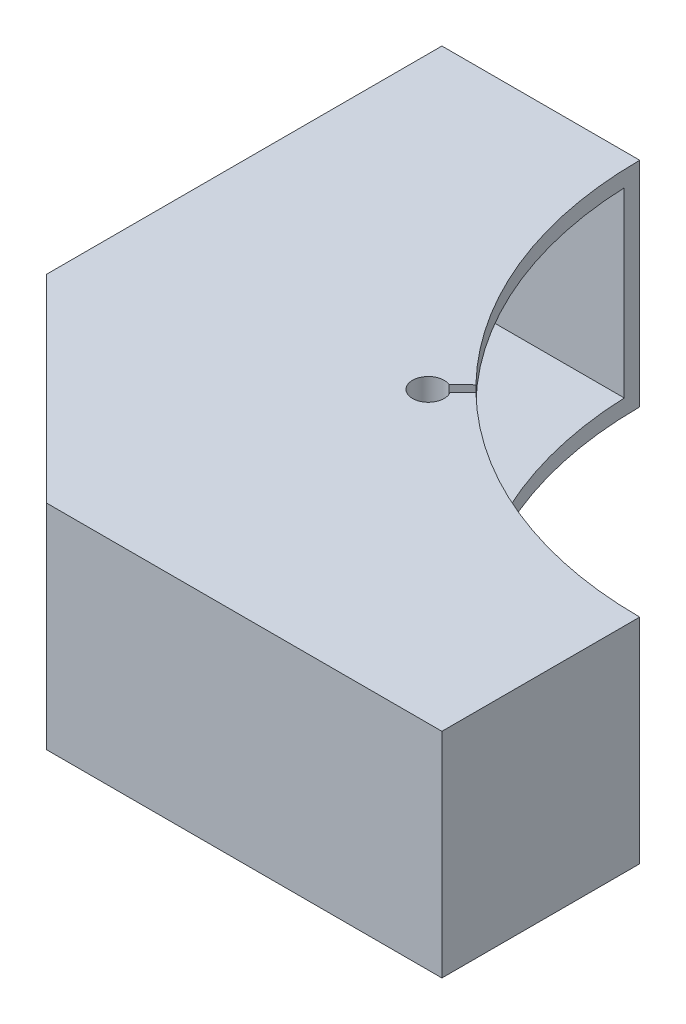
ISO-10303-21;
HEADER;
FILE_DESCRIPTION(('STEP AP214'),'2;1');
FILE_NAME('part.step','',(''),(''),'','','');
FILE_SCHEMA(('AUTOMOTIVE_DESIGN { 1 0 10303 214 1 1 1 1 }'));
ENDSEC;
DATA;
#1=APPLICATION_CONTEXT('core data for automotive mechanical design processes');
#2=APPLICATION_PROTOCOL_DEFINITION('international standard','automotive_design',2000,#1);
#3=PRODUCT_CONTEXT('',#1,'mechanical');
#4=PRODUCT('Part','Part','',(#3));
#5=PRODUCT_RELATED_PRODUCT_CATEGORY('part','',(#4));
#6=PRODUCT_DEFINITION_FORMATION('','',#4);
#7=PRODUCT_DEFINITION_CONTEXT('part definition',#1,'design');
#8=PRODUCT_DEFINITION('design','',#6,#7);
#9=PRODUCT_DEFINITION_SHAPE('','',#8);
#10=(LENGTH_UNIT() NAMED_UNIT(*) SI_UNIT(.MILLI.,.METRE.));
#11=(NAMED_UNIT(*) PLANE_ANGLE_UNIT() SI_UNIT($,.RADIAN.));
#12=(NAMED_UNIT(*) SI_UNIT($,.STERADIAN.) SOLID_ANGLE_UNIT());
#13=UNCERTAINTY_MEASURE_WITH_UNIT(LENGTH_MEASURE(1.E-05),#10,'distance_accuracy_value','');
#14=(GEOMETRIC_REPRESENTATION_CONTEXT(3) GLOBAL_UNCERTAINTY_ASSIGNED_CONTEXT((#13)) GLOBAL_UNIT_ASSIGNED_CONTEXT((#10,
#11,#12)) REPRESENTATION_CONTEXT('',''));
#15=CARTESIAN_POINT('',(0.,0.,0.));
#16=DIRECTION('',(0.,0.,1.));
#17=DIRECTION('',(1.,0.,0.));
#18=AXIS2_PLACEMENT_3D('',#15,#16,#17);
#19=CARTESIAN_POINT('',(0.,25.,-74.9999999580492));
#20=DIRECTION('',(0.,-1.,0.));
#21=DIRECTION('',(0.,0.,-1.));
#22=AXIS2_PLACEMENT_3D('',#19,#20,#21);
#23=PLANE('',#22);
#24=DIRECTION('',(0.715540732755675,0.,-0.698571012687666));
#25=VECTOR('',#24,1.);
#26=CARTESIAN_POINT('',(0.,25.,-74.9999999580491));
#27=LINE('',#26,#25);
#28=CARTESIAN_POINT('',(-35.8003233854942,25.,-40.0487148430338));
#29=VERTEX_POINT('',#28);
#30=CARTESIAN_POINT('',(-35.7770366077663,25.,-40.0714493529715));
#31=VERTEX_POINT('',#30);
#32=EDGE_CURVE('E458',#29,#31,#27,.T.);
#33=ORIENTED_EDGE('',*,*,#32,.F.);
#34=CARTESIAN_POINT('',(-38.2770016922572,25.,-36.5609110701959));
#35=DIRECTION('',(0.,-1.,0.));
#36=DIRECTION('',(0.,0.,-1.));
#37=AXIS2_PLACEMENT_3D('',#34,#35,#36);
#38=CIRCLE('',#37,4.27769921722097);
#39=CARTESIAN_POINT('',(-34.9285079943552,25.,-39.2229216915351));
#40=VERTEX_POINT('',#39);
#41=EDGE_CURVE('E242',#40,#29,#38,.T.);
#42=ORIENTED_EDGE('',*,*,#41,.F.);
#43=CARTESIAN_POINT('',(0.,25.,-74.9999999580492));
#44=DIRECTION('',(0.,-1.,0.));
#45=DIRECTION('',(0.,0.,-1.));
#46=AXIS2_PLACEMENT_3D('',#43,#44,#45);
#47=CIRCLE('',#46,50.);
#48=CARTESIAN_POINT('',(-2.,25.,-25.040015970862));
#49=VERTEX_POINT('',#48);
#50=EDGE_CURVE('E417',#49,#40,#47,.T.);
#51=ORIENTED_EDGE('',*,*,#50,.F.);
#52=DIRECTION('',(0.,0.,-1.));
#53=VECTOR('',#52,1.);
#54=CARTESIAN_POINT('',(-2.,25.,-74.9999999580492));
#55=LINE('',#54,#53);
#56=CARTESIAN_POINT('',(-2.,25.,-2.00000000000001));
#57=VERTEX_POINT('',#56);
#58=EDGE_CURVE('E414',#57,#49,#55,.T.);
#59=ORIENTED_EDGE('',*,*,#58,.F.);
#60=DIRECTION('',(1.,0.,0.));
#61=VECTOR('',#60,1.);
#62=CARTESIAN_POINT('',(-5.99988808345734E-13,25.,-2.));
#63=LINE('',#62,#61);
#64=CARTESIAN_POINT('',(-49.1715728752538,25.,-2.00000000000034));
#65=VERTEX_POINT('',#64);
#66=EDGE_CURVE('E423',#65,#57,#63,.T.);
#67=ORIENTED_EDGE('',*,*,#66,.F.);
#68=DIRECTION('',(0.707106781186553,0.,0.707106781186542));
#69=VECTOR('',#68,1.);
#70=CARTESIAN_POINT('',(-61.085786416651,25.,-13.9142135413973));
#71=LINE('',#70,#69);
#72=CARTESIAN_POINT('',(-57.2752746399999,25.,-10.1037017647463));
#73=VERTEX_POINT('',#72);
#74=EDGE_CURVE('E436',#73,#65,#71,.T.);
#75=ORIENTED_EDGE('',*,*,#74,.F.);
#76=DIRECTION('',(-0.707106781186542,0.,0.707106781186553));
#77=VECTOR('',#76,1.);
#78=CARTESIAN_POINT('',(-51.9542961115712,25.,-15.4246802931752));
#79=LINE('',#78,#77);
#80=CARTESIAN_POINT('',(-51.9542961115712,25.,-15.4246802931752));
#81=VERTEX_POINT('',#80);
#82=EDGE_CURVE('E407',#81,#73,#79,.T.);
#83=ORIENTED_EDGE('',*,*,#82,.F.);
#84=DIRECTION('',(-0.707106781186553,0.,-0.707106781186542));
#85=VECTOR('',#84,1.);
#86=CARTESIAN_POINT('',(-55.7648078882223,25.,-19.2351920698262));
#87=LINE('',#86,#85);
#88=CARTESIAN_POINT('',(-59.5753196648744,25.,-23.0457038464782));
#89=VERTEX_POINT('',#88);
#90=EDGE_CURVE('E548',#81,#89,#87,.T.);
#91=ORIENTED_EDGE('',*,*,#90,.T.);
#92=DIRECTION('',(-0.707106781186542,0.,0.707106781186553));
#93=VECTOR('',#92,1.);
#94=CARTESIAN_POINT('',(-59.5753196648744,25.,-23.0457038464782));
#95=LINE('',#94,#93);
#96=CARTESIAN_POINT('',(-64.8962981933031,25.,-17.7247253180494));
#97=VERTEX_POINT('',#96);
#98=EDGE_CURVE('E547',#97,#89,#95,.F.);
#99=ORIENTED_EDGE('',*,*,#98,.F.);
#100=CARTESIAN_POINT('',(-72.9999999580492,25.,-25.8284270827954));
#101=VERTEX_POINT('',#100);
#102=EDGE_CURVE('E427',#101,#97,#71,.T.);
#103=ORIENTED_EDGE('',*,*,#102,.F.);
#104=DIRECTION('',(0.,0.,1.));
#105=VECTOR('',#104,1.);
#106=CARTESIAN_POINT('',(-72.9999999580492,25.,-74.9999999580492));
#107=LINE('',#106,#105);
#108=CARTESIAN_POINT('',(-72.9999999580492,25.,-72.9999999580492));
#109=VERTEX_POINT('',#108);
#110=EDGE_CURVE('E442',#109,#101,#107,.T.);
#111=ORIENTED_EDGE('',*,*,#110,.F.);
#112=DIRECTION('',(-1.,0.,0.));
#113=VECTOR('',#112,1.);
#114=CARTESIAN_POINT('',(0.,25.,-72.9999999580492));
#115=LINE('',#114,#113);
#116=CARTESIAN_POINT('',(-49.9599839452028,25.,-72.9999999580492));
#117=VERTEX_POINT('',#116);
#118=EDGE_CURVE('E444',#117,#109,#115,.T.);
#119=ORIENTED_EDGE('',*,*,#118,.F.);
#120=CARTESIAN_POINT('',(0.,25.,-74.9999999580492));
#121=DIRECTION('',(0.,-1.,0.));
#122=DIRECTION('',(0.,0.,-1.));
#123=AXIS2_PLACEMENT_3D('',#120,#121,#122);
#124=CIRCLE('',#123,49.9999999580491);
#125=EDGE_CURVE('E450',#31,#117,#124,.T.);
#126=ORIENTED_EDGE('',*,*,#125,.F.);
#127=EDGE_LOOP('',(#33,#42,#51,#59,#67,#75,#83,#91,#99,#103,#111,#119,#126));
#128=FACE_BOUND('',#127,.T.);
#129=ADVANCED_FACE('F35',(#128),#23,.T.);
#130=CARTESIAN_POINT('',(0.,2.,-74.9999999580492));
#131=DIRECTION('',(0.,-1.,0.));
#132=DIRECTION('',(0.,0.,-1.));
#133=AXIS2_PLACEMENT_3D('',#130,#131,#132);
#134=PLANE('',#133);
#135=CARTESIAN_POINT('',(-38.2770016922572,2.,-36.5609110701959));
#136=DIRECTION('',(0.,1.,0.));
#137=DIRECTION('',(0.,0.,1.));
#138=AXIS2_PLACEMENT_3D('',#135,#136,#137);
#139=CIRCLE('',#138,4.30972208599431);
#140=CARTESIAN_POINT('',(-35.7770366077663,2.,-40.0714493529715));
#141=VERTEX_POINT('',#140);
#142=CARTESIAN_POINT('',(-34.7770585127545,2.,-39.0756878393675));
#143=VERTEX_POINT('',#142);
#144=EDGE_CURVE('E249',#141,#143,#139,.T.);
#145=ORIENTED_EDGE('',*,*,#144,.F.);
#146=CARTESIAN_POINT('',(0.,2.,-74.9999999580492));
#147=DIRECTION('',(0.,-1.,0.));
#148=DIRECTION('',(0.,0.,-1.));
#149=AXIS2_PLACEMENT_3D('',#146,#147,#148);
#150=CIRCLE('',#149,49.9999999580491);
#151=CARTESIAN_POINT('',(-49.9599839452028,2.,-72.9999999580492));
#152=VERTEX_POINT('',#151);
#153=EDGE_CURVE('E400',#141,#152,#150,.T.);
#154=ORIENTED_EDGE('',*,*,#153,.T.);
#155=DIRECTION('',(-1.,0.,0.));
#156=VECTOR('',#155,1.);
#157=CARTESIAN_POINT('',(0.,2.,-72.9999999580492));
#158=LINE('',#157,#156);
#159=CARTESIAN_POINT('',(-72.9999999580492,2.,-72.9999999580492));
#160=VERTEX_POINT('',#159);
#161=EDGE_CURVE('E404',#152,#160,#158,.T.);
#162=ORIENTED_EDGE('',*,*,#161,.T.);
#163=DIRECTION('',(0.,0.,1.));
#164=VECTOR('',#163,1.);
#165=CARTESIAN_POINT('',(-72.9999999580492,2.,-74.9999999580492));
#166=LINE('',#165,#164);
#167=CARTESIAN_POINT('',(-72.9999999580492,2.,-25.8284270827954));
#168=VERTEX_POINT('',#167);
#169=EDGE_CURVE('E440',#160,#168,#166,.T.);
#170=ORIENTED_EDGE('',*,*,#169,.T.);
#171=DIRECTION('',(0.707106781186553,0.,0.707106781186542));
#172=VECTOR('',#171,1.);
#173=CARTESIAN_POINT('',(-61.085786416651,2.,-13.9142135413973));
#174=LINE('',#173,#172);
#175=CARTESIAN_POINT('',(-64.8962981933031,2.,-17.7247253180494));
#176=VERTEX_POINT('',#175);
#177=EDGE_CURVE('E425',#168,#176,#174,.T.);
#178=ORIENTED_EDGE('',*,*,#177,.T.);
#179=DIRECTION('',(-0.707106781186542,0.,0.707106781186553));
#180=VECTOR('',#179,1.);
#181=CARTESIAN_POINT('',(-59.5753196648744,2.,-23.0457038464782));
#182=LINE('',#181,#180);
#183=CARTESIAN_POINT('',(-59.5753196648744,2.,-23.0457038464782));
#184=VERTEX_POINT('',#183);
#185=EDGE_CURVE('E45',#176,#184,#182,.F.);
#186=ORIENTED_EDGE('',*,*,#185,.T.);
#187=DIRECTION('',(-0.707106781186553,0.,-0.707106781186542));
#188=VECTOR('',#187,1.);
#189=CARTESIAN_POINT('',(-55.7648078882223,2.,-19.2351920698262));
#190=LINE('',#189,#188);
#191=CARTESIAN_POINT('',(-51.9542961115712,2.,-15.4246802931752));
#192=VERTEX_POINT('',#191);
#193=EDGE_CURVE('E536',#192,#184,#190,.T.);
#194=ORIENTED_EDGE('',*,*,#193,.F.);
#195=DIRECTION('',(-0.707106781186542,0.,0.707106781186553));
#196=VECTOR('',#195,1.);
#197=CARTESIAN_POINT('',(-51.9542961115712,2.,-15.4246802931752));
#198=LINE('',#197,#196);
#199=CARTESIAN_POINT('',(-57.27527464,2.,-10.1037017647463));
#200=VERTEX_POINT('',#199);
#201=EDGE_CURVE('E11',#192,#200,#198,.T.);
#202=ORIENTED_EDGE('',*,*,#201,.T.);
#203=CARTESIAN_POINT('',(-49.1715728752538,2.,-2.00000000000034));
#204=VERTEX_POINT('',#203);
#205=EDGE_CURVE('E433',#200,#204,#174,.T.);
#206=ORIENTED_EDGE('',*,*,#205,.T.);
#207=DIRECTION('',(1.,0.,0.));
#208=VECTOR('',#207,1.);
#209=CARTESIAN_POINT('',(-5.99988808345734E-13,2.,-2.));
#210=LINE('',#209,#208);
#211=CARTESIAN_POINT('',(-2.,2.,-2.00000000000001));
#212=VERTEX_POINT('',#211);
#213=EDGE_CURVE('E418',#204,#212,#210,.T.);
#214=ORIENTED_EDGE('',*,*,#213,.T.);
#215=DIRECTION('',(0.,0.,-1.));
#216=VECTOR('',#215,1.);
#217=CARTESIAN_POINT('',(-2.,2.,-74.9999999580492));
#218=LINE('',#217,#216);
#219=CARTESIAN_POINT('',(-2.,2.,-25.040015970862));
#220=VERTEX_POINT('',#219);
#221=EDGE_CURVE('E406',#212,#220,#218,.T.);
#222=ORIENTED_EDGE('',*,*,#221,.T.);
#223=CARTESIAN_POINT('',(0.,2.,-74.9999999580492));
#224=DIRECTION('',(0.,-1.,0.));
#225=DIRECTION('',(0.,0.,-1.));
#226=AXIS2_PLACEMENT_3D('',#223,#224,#225);
#227=CIRCLE('',#226,50.);
#228=EDGE_CURVE('E394',#220,#143,#227,.T.);
#229=ORIENTED_EDGE('',*,*,#228,.T.);
#230=EDGE_LOOP('',(#145,#154,#162,#170,#178,#186,#194,#202,#206,#214,#222,#229));
#231=FACE_BOUND('',#230,.T.);
#232=ADVANCED_FACE('F343',(#231),#134,.F.);
#233=CARTESIAN_POINT('',(-48.5857864376269,27.,-1.41421356237345));
#234=DIRECTION('',(0.707106781186542,0.,-0.707106781186553));
#235=DIRECTION('',(-0.707106781186553,0.,-0.707106781186542));
#236=AXIS2_PLACEMENT_3D('',#233,#234,#235);
#237=PLANE('',#236);
#238=CARTESIAN_POINT('',(-61.0857864166515,13.5,-13.9142135413979));
#239=DIRECTION('',(0.707106781186542,0.,-0.707106781186553));
#240=DIRECTION('',(-0.707106781186553,0.,-0.707106781186542));
#241=AXIS2_PLACEMENT_3D('',#238,#239,#240);
#242=CIRCLE('',#241,12.7);
#243=EDGE_CURVE('E410',#73,#200,#242,.T.);
#244=ORIENTED_EDGE('',*,*,#243,.F.);
#245=ORIENTED_EDGE('',*,*,#74,.T.);
#246=DIRECTION('',(0.,-1.,0.));
#247=VECTOR('',#246,1.);
#248=CARTESIAN_POINT('',(-49.1715728752538,27.,-2.00000000000034));
#249=LINE('',#248,#247);
#250=EDGE_CURVE('E422',#65,#204,#249,.T.);
#251=ORIENTED_EDGE('',*,*,#250,.T.);
#252=ORIENTED_EDGE('',*,*,#205,.F.);
#253=EDGE_LOOP('',(#244,#245,#251,#252));
#254=FACE_BOUND('',#253,.T.);
#255=ADVANCED_FACE('F337',(#254),#237,.T.);
#256=CARTESIAN_POINT('',(0.,27.,-74.9999999580492));
#257=DIRECTION('',(0.,-1.,0.));
#258=DIRECTION('',(0.,0.,-1.));
#259=AXIS2_PLACEMENT_3D('',#256,#257,#258);
#260=CYLINDRICAL_SURFACE('',#259,50.);
#261=ORIENTED_EDGE('',*,*,#228,.F.);
#262=DIRECTION('',(0.,-1.,0.));
#263=VECTOR('',#262,1.);
#264=CARTESIAN_POINT('',(-2.,25.,-25.040015970862));
#265=LINE('',#264,#263);
#266=EDGE_CURVE('E451',#49,#220,#265,.T.);
#267=ORIENTED_EDGE('',*,*,#266,.F.);
#268=ORIENTED_EDGE('',*,*,#50,.T.);
#269=DIRECTION('',(0.,-1.,0.));
#270=VECTOR('',#269,1.);
#271=CARTESIAN_POINT('',(-34.9285079943551,27.,-39.2229216915351));
#272=LINE('',#271,#270);
#273=CARTESIAN_POINT('',(-34.9285079943551,27.,-39.2229216915351));
#274=VERTEX_POINT('',#273);
#275=EDGE_CURVE('E248',#274,#40,#272,.T.);
#276=ORIENTED_EDGE('',*,*,#275,.F.);
#277=CARTESIAN_POINT('',(0.,27.,-74.9999999580492));
#278=DIRECTION('',(0.,-1.,0.));
#279=DIRECTION('',(0.,0.,-1.));
#280=AXIS2_PLACEMENT_3D('',#277,#278,#279);
#281=CIRCLE('',#280,50.);
#282=CARTESIAN_POINT('',(0.,27.,-24.9999999580492));
#283=VERTEX_POINT('',#282);
#284=EDGE_CURVE('E465',#283,#274,#281,.T.);
#285=ORIENTED_EDGE('',*,*,#284,.F.);
#286=DIRECTION('',(0.,-1.,0.));
#287=VECTOR('',#286,1.);
#288=CARTESIAN_POINT('',(0.,27.,-24.9999999580492));
#289=LINE('',#288,#287);
#290=CARTESIAN_POINT('',(0.,0.,-24.9999999580492));
#291=VERTEX_POINT('',#290);
#292=EDGE_CURVE('E533',#283,#291,#289,.T.);
#293=ORIENTED_EDGE('',*,*,#292,.T.);
#294=CARTESIAN_POINT('',(0.,0.,-74.9999999580492));
#295=DIRECTION('',(0.,-1.,0.));
#296=DIRECTION('',(0.,0.,-1.));
#297=AXIS2_PLACEMENT_3D('',#294,#295,#296);
#298=CIRCLE('',#297,50.);
#299=CARTESIAN_POINT('',(-34.9285079943551,0.,-39.2229216915351));
#300=VERTEX_POINT('',#299);
#301=EDGE_CURVE('E487',#291,#300,#298,.T.);
#302=ORIENTED_EDGE('',*,*,#301,.T.);
#303=CARTESIAN_POINT('',(-34.9285079943551,2.,-39.2229216915351));
#304=VERTEX_POINT('',#303);
#305=EDGE_CURVE('E39',#304,#300,#272,.T.);
#306=ORIENTED_EDGE('',*,*,#305,.F.);
#307=CARTESIAN_POINT('',(-34.7770585127573,2.,-39.0756878393703));
#308=DIRECTION('',(-0.717015503327151,0.,-0.697057220024663));
#309=VECTOR('',#308,1.);
#310=LINE('',#307,#309);
#311=EDGE_CURVE('E53',#143,#304,#310,.T.);
#312=ORIENTED_EDGE('',*,*,#311,.F.);
#313=EDGE_LOOP('',(#261,#267,#268,#276,#285,#293,#302,#306,#312));
#314=FACE_BOUND('',#313,.T.);
#315=ADVANCED_FACE('F387',(#314),#260,.F.);
#316=CARTESIAN_POINT('',(-34.9285079943551,27.,-39.2229216915351));
#317=DIRECTION('',(0.698571012687669,0.,0.715540732755673));
#318=DIRECTION('',(0.715540732755673,0.,-0.698571012687669));
#319=AXIS2_PLACEMENT_3D('',#316,#317,#318);
#320=PLANE('',#319);
#321=DIRECTION('',(0.,-1.,0.));
#322=VECTOR('',#321,1.);
#323=CARTESIAN_POINT('',(-36.5766338547149,27.,-37.6138826828482));
#324=LINE('',#323,#322);
#325=CARTESIAN_POINT('',(-36.5766338547149,6.,-37.6138826828482));
#326=VERTEX_POINT('',#325);
#327=CARTESIAN_POINT('',(-36.5766338547149,0.,-37.6138826828482));
#328=VERTEX_POINT('',#327);
#329=EDGE_CURVE('E529',#326,#328,#324,.T.);
#330=ORIENTED_EDGE('',*,*,#329,.F.);
#331=DIRECTION('',(-0.715540732755674,0.,0.698571012687667));
#332=VECTOR('',#331,1.);
#333=CARTESIAN_POINT('',(-36.5766338547149,6.,-37.6138826828482));
#334=LINE('',#333,#332);
#335=CARTESIAN_POINT('',(-34.9285079943551,6.,-39.2229216915351));
#336=VERTEX_POINT('',#335);
#337=EDGE_CURVE('E261',#336,#326,#334,.T.);
#338=ORIENTED_EDGE('',*,*,#337,.F.);
#339=DIRECTION('',(0.,-1.,0.));
#340=VECTOR('',#339,1.);
#341=CARTESIAN_POINT('',(-34.9285079943551,6.,-39.2229216915351));
#342=LINE('',#341,#340);
#343=EDGE_CURVE('E272',#336,#304,#342,.T.);
#344=ORIENTED_EDGE('',*,*,#343,.T.);
#345=ORIENTED_EDGE('',*,*,#305,.T.);
#346=DIRECTION('',(-0.715540732755673,0.,0.698571012687669));
#347=VECTOR('',#346,1.);
#348=CARTESIAN_POINT('',(-34.9285079943551,0.,-39.2229216915351));
#349=LINE('',#348,#347);
#350=EDGE_CURVE('E490',#300,#328,#349,.T.);
#351=ORIENTED_EDGE('',*,*,#350,.T.);
#352=EDGE_LOOP('',(#330,#338,#344,#345,#351));
#353=FACE_BOUND('',#352,.T.);
#354=ADVANCED_FACE('F386',(#353),#320,.F.);
#355=CARTESIAN_POINT('',(-38.2770016922572,27.,-36.5609110701959));
#356=DIRECTION('',(0.,-1.,0.));
#357=DIRECTION('',(0.,0.,-1.));
#358=AXIS2_PLACEMENT_3D('',#355,#356,#357);
#359=CYLINDRICAL_SURFACE('',#358,1.99999999999999);
#360=DIRECTION('',(0.,-1.,0.));
#361=VECTOR('',#360,1.);
#362=CARTESIAN_POINT('',(-37.4896802359104,27.,-38.3994226759182));
#363=LINE('',#362,#361);
#364=CARTESIAN_POINT('',(-37.4896802359104,6.,-38.3994226759182));
#365=VERTEX_POINT('',#364);
#366=CARTESIAN_POINT('',(-37.4896802359104,0.,-38.3994226759182));
#367=VERTEX_POINT('',#366);
#368=EDGE_CURVE('E526',#365,#367,#363,.T.);
#369=ORIENTED_EDGE('',*,*,#368,.F.);
#370=CARTESIAN_POINT('',(-38.2770016922572,6.,-36.5609110701959));
#371=DIRECTION('',(0.,-1.,0.));
#372=DIRECTION('',(0.,0.,-1.));
#373=AXIS2_PLACEMENT_3D('',#370,#371,#372);
#374=CIRCLE('',#373,1.99999999999999);
#375=EDGE_CURVE('E264',#326,#365,#374,.T.);
#376=ORIENTED_EDGE('',*,*,#375,.F.);
#377=ORIENTED_EDGE('',*,*,#329,.T.);
#378=CARTESIAN_POINT('',(-38.2770016922572,0.,-36.5609110701959));
#379=DIRECTION('',(0.,-1.,0.));
#380=DIRECTION('',(0.,0.,-1.));
#381=AXIS2_PLACEMENT_3D('',#378,#379,#380);
#382=CIRCLE('',#381,1.99999999999999);
#383=EDGE_CURVE('E493',#328,#367,#382,.T.);
#384=ORIENTED_EDGE('',*,*,#383,.T.);
#385=EDGE_LOOP('',(#369,#376,#377,#384));
#386=FACE_BOUND('',#385,.T.);
#387=ADVANCED_FACE('F384',(#386),#359,.F.);
#388=CARTESIAN_POINT('',(-35.7770366077662,27.,-40.0714493529715));
#389=DIRECTION('',(-0.698571012687666,0.,-0.715540732755675));
#390=DIRECTION('',(-0.715540732755675,0.,0.698571012687666));
#391=AXIS2_PLACEMENT_3D('',#388,#389,#390);
#392=PLANE('',#391);
#393=DIRECTION('',(0.,-1.,0.));
#394=VECTOR('',#393,1.);
#395=CARTESIAN_POINT('',(-35.7770366077663,27.,-40.0714493529715));
#396=LINE('',#395,#394);
#397=CARTESIAN_POINT('',(-35.7770366077663,0.,-40.0714493529715));
#398=VERTEX_POINT('',#397);
#399=EDGE_CURVE('E522',#141,#398,#396,.T.);
#400=ORIENTED_EDGE('',*,*,#399,.F.);
#401=DIRECTION('',(0.,-1.,0.));
#402=VECTOR('',#401,1.);
#403=CARTESIAN_POINT('',(-35.7770366077663,6.,-40.0714493529715));
#404=LINE('',#403,#402);
#405=CARTESIAN_POINT('',(-35.7770366077663,6.,-40.0714493529715));
#406=VERTEX_POINT('',#405);
#407=EDGE_CURVE('E269',#406,#141,#404,.T.);
#408=ORIENTED_EDGE('',*,*,#407,.F.);
#409=DIRECTION('',(0.715540732755676,0.,-0.698571012687665));
#410=VECTOR('',#409,1.);
#411=CARTESIAN_POINT('',(-37.4896802359104,6.,-38.3994226759182));
#412=LINE('',#411,#410);
#413=EDGE_CURVE('E267',#365,#406,#412,.T.);
#414=ORIENTED_EDGE('',*,*,#413,.F.);
#415=ORIENTED_EDGE('',*,*,#368,.T.);
#416=DIRECTION('',(0.715540732755675,0.,-0.698571012687666));
#417=VECTOR('',#416,1.);
#418=CARTESIAN_POINT('',(-35.7770366077662,0.,-40.0714493529715));
#419=LINE('',#418,#417);
#420=EDGE_CURVE('E496',#367,#398,#419,.T.);
#421=ORIENTED_EDGE('',*,*,#420,.T.);
#422=EDGE_LOOP('',(#400,#408,#414,#415,#421));
#423=FACE_BOUND('',#422,.T.);
#424=ADVANCED_FACE('F375',(#423),#392,.F.);
#425=CARTESIAN_POINT('',(0.,27.,-74.9999999580492));
#426=DIRECTION('',(0.,-1.,0.));
#427=DIRECTION('',(0.,0.,-1.));
#428=AXIS2_PLACEMENT_3D('',#425,#426,#427);
#429=CYLINDRICAL_SURFACE('',#428,49.9999999580491);
#430=ORIENTED_EDGE('',*,*,#153,.F.);
#431=ORIENTED_EDGE('',*,*,#399,.T.);
#432=CARTESIAN_POINT('',(0.,0.,-74.9999999580492));
#433=DIRECTION('',(0.,-1.,0.));
#434=DIRECTION('',(0.,0.,1.));
#435=AXIS2_PLACEMENT_3D('',#432,#433,#434);
#436=CIRCLE('',#435,49.9999999580491);
#437=CARTESIAN_POINT('',(-49.9999999580492,0.,-74.9999999580492));
#438=VERTEX_POINT('',#437);
#439=EDGE_CURVE('E499',#398,#438,#436,.T.);
#440=ORIENTED_EDGE('',*,*,#439,.T.);
#441=DIRECTION('',(0.,-1.,0.));
#442=VECTOR('',#441,1.);
#443=CARTESIAN_POINT('',(-49.9999999580492,27.,-74.9999999580492));
#444=LINE('',#443,#442);
#445=CARTESIAN_POINT('',(-49.9999999580492,27.,-74.9999999580492));
#446=VERTEX_POINT('',#445);
#447=EDGE_CURVE('E519',#446,#438,#444,.T.);
#448=ORIENTED_EDGE('',*,*,#447,.F.);
#449=CARTESIAN_POINT('',(0.,27.,-74.9999999580492));
#450=DIRECTION('',(0.,-1.,0.));
#451=DIRECTION('',(0.,0.,1.));
#452=AXIS2_PLACEMENT_3D('',#449,#450,#451);
#453=CIRCLE('',#452,49.9999999580491);
#454=CARTESIAN_POINT('',(-35.7770366077663,27.,-40.0714493529715));
#455=VERTEX_POINT('',#454);
#456=EDGE_CURVE('E474',#455,#446,#453,.T.);
#457=ORIENTED_EDGE('',*,*,#456,.F.);
#458=EDGE_CURVE('E523',#455,#31,#396,.T.);
#459=ORIENTED_EDGE('',*,*,#458,.T.);
#460=ORIENTED_EDGE('',*,*,#125,.T.);
#461=DIRECTION('',(0.,-1.,0.));
#462=VECTOR('',#461,1.);
#463=CARTESIAN_POINT('',(-49.9599839452028,25.,-72.9999999580492));
#464=LINE('',#463,#462);
#465=EDGE_CURVE('E447',#117,#152,#464,.T.);
#466=ORIENTED_EDGE('',*,*,#465,.T.);
#467=EDGE_LOOP('',(#430,#431,#440,#448,#457,#459,#460,#466));
#468=FACE_BOUND('',#467,.T.);
#469=ADVANCED_FACE('F372',(#468),#429,.F.);
#470=CARTESIAN_POINT('',(0.,27.,0.));
#471=DIRECTION('',(-1.,0.,0.));
#472=DIRECTION('',(0.,0.,1.));
#473=AXIS2_PLACEMENT_3D('',#470,#471,#472);
#474=PLANE('',#473);
#475=DIRECTION('',(0.,0.,-1.));
#476=VECTOR('',#475,1.);
#477=CARTESIAN_POINT('',(0.,0.,0.));
#478=LINE('',#477,#476);
#479=CARTESIAN_POINT('',(0.,0.,0.));
#480=VERTEX_POINT('',#479);
#481=EDGE_CURVE('E452',#480,#291,#478,.T.);
#482=ORIENTED_EDGE('',*,*,#481,.T.);
#483=ORIENTED_EDGE('',*,*,#292,.F.);
#484=DIRECTION('',(0.,0.,-1.));
#485=VECTOR('',#484,1.);
#486=CARTESIAN_POINT('',(0.,27.,0.));
#487=LINE('',#486,#485);
#488=CARTESIAN_POINT('',(0.,27.,0.));
#489=VERTEX_POINT('',#488);
#490=EDGE_CURVE('E462',#489,#283,#487,.T.);
#491=ORIENTED_EDGE('',*,*,#490,.F.);
#492=DIRECTION('',(0.,-1.,0.));
#493=VECTOR('',#492,1.);
#494=CARTESIAN_POINT('',(0.,27.,0.));
#495=LINE('',#494,#493);
#496=EDGE_CURVE('E484',#489,#480,#495,.T.);
#497=ORIENTED_EDGE('',*,*,#496,.T.);
#498=EDGE_LOOP('',(#482,#483,#491,#497));
#499=FACE_BOUND('',#498,.T.);
#500=ADVANCED_FACE('F37',(#499),#474,.F.);
#501=ORIENTED_EDGE('',*,*,#275,.T.);
#502=DIRECTION('',(0.,1.,0.));
#503=VECTOR('',#502,1.);
#504=CARTESIAN_POINT('',(-34.9285079943552,21.,-39.2229216915351));
#505=LINE('',#504,#503);
#506=CARTESIAN_POINT('',(-34.9285079943552,21.,-39.2229216915351));
#507=VERTEX_POINT('',#506);
#508=EDGE_CURVE('E225',#507,#40,#505,.T.);
#509=ORIENTED_EDGE('',*,*,#508,.F.);
#510=DIRECTION('',(0.715540732755673,0.,-0.698571012687669));
#511=VECTOR('',#510,1.);
#512=CARTESIAN_POINT('',(-36.6509761946929,21.,-37.5413034412389));
#513=LINE('',#512,#511);
#514=CARTESIAN_POINT('',(-36.5766338547149,21.,-37.6138826828482));
#515=VERTEX_POINT('',#514);
#516=EDGE_CURVE('E233',#515,#507,#513,.T.);
#517=ORIENTED_EDGE('',*,*,#516,.F.);
#518=CARTESIAN_POINT('',(-36.5766338547149,27.,-37.6138826828482));
#519=VERTEX_POINT('',#518);
#520=EDGE_CURVE('E530',#519,#515,#324,.T.);
#521=ORIENTED_EDGE('',*,*,#520,.F.);
#522=DIRECTION('',(-0.715540732755673,0.,0.698571012687669));
#523=VECTOR('',#522,1.);
#524=CARTESIAN_POINT('',(-34.9285079943551,27.,-39.2229216915351));
#525=LINE('',#524,#523);
#526=EDGE_CURVE('E468',#274,#519,#525,.T.);
#527=ORIENTED_EDGE('',*,*,#526,.F.);
#528=EDGE_LOOP('',(#501,#509,#517,#521,#527));
#529=FACE_BOUND('',#528,.T.);
#530=ADVANCED_FACE('F245',(#529),#320,.F.);
#531=ORIENTED_EDGE('',*,*,#520,.T.);
#532=CARTESIAN_POINT('',(-38.2770016922572,21.,-36.5609110701959));
#533=DIRECTION('',(0.,-1.,0.));
#534=DIRECTION('',(0.,0.,-1.));
#535=AXIS2_PLACEMENT_3D('',#532,#533,#534);
#536=CIRCLE('',#535,1.99999999999999);
#537=CARTESIAN_POINT('',(-37.4896802359104,21.,-38.3994226759182));
#538=VERTEX_POINT('',#537);
#539=EDGE_CURVE('E239',#538,#515,#536,.F.);
#540=ORIENTED_EDGE('',*,*,#539,.F.);
#541=CARTESIAN_POINT('',(-37.4896802359104,27.,-38.3994226759182));
#542=VERTEX_POINT('',#541);
#543=EDGE_CURVE('E527',#542,#538,#363,.T.);
#544=ORIENTED_EDGE('',*,*,#543,.F.);
#545=CARTESIAN_POINT('',(-38.2770016922572,27.,-36.5609110701959));
#546=DIRECTION('',(0.,-1.,0.));
#547=DIRECTION('',(0.,0.,-1.));
#548=AXIS2_PLACEMENT_3D('',#545,#546,#547);
#549=CIRCLE('',#548,1.99999999999999);
#550=EDGE_CURVE('E470',#519,#542,#549,.T.);
#551=ORIENTED_EDGE('',*,*,#550,.F.);
#552=EDGE_LOOP('',(#531,#540,#544,#551));
#553=FACE_BOUND('',#552,.T.);
#554=ADVANCED_FACE('F379',(#553),#359,.F.);
#555=ORIENTED_EDGE('',*,*,#543,.T.);
#556=DIRECTION('',(-0.715540732755675,0.,0.698571012687666));
#557=VECTOR('',#556,1.);
#558=CARTESIAN_POINT('',(-37.4892010515611,21.,-38.3998904959609));
#559=LINE('',#558,#557);
#560=CARTESIAN_POINT('',(-35.8003233854942,21.,-40.0487148430338));
#561=VERTEX_POINT('',#560);
#562=EDGE_CURVE('E232',#561,#538,#559,.T.);
#563=ORIENTED_EDGE('',*,*,#562,.F.);
#564=DIRECTION('',(0.,1.,0.));
#565=VECTOR('',#564,1.);
#566=CARTESIAN_POINT('',(-35.8003233854942,21.,-40.0487148430338));
#567=LINE('',#566,#565);
#568=EDGE_CURVE('E228',#561,#29,#567,.T.);
#569=ORIENTED_EDGE('',*,*,#568,.T.);
#570=ORIENTED_EDGE('',*,*,#32,.T.);
#571=ORIENTED_EDGE('',*,*,#458,.F.);
#572=DIRECTION('',(0.715540732755675,0.,-0.698571012687666));
#573=VECTOR('',#572,1.);
#574=CARTESIAN_POINT('',(-35.7770366077662,27.,-40.0714493529715));
#575=LINE('',#574,#573);
#576=EDGE_CURVE('E472',#542,#455,#575,.T.);
#577=ORIENTED_EDGE('',*,*,#576,.F.);
#578=EDGE_LOOP('',(#555,#563,#569,#570,#571,#577));
#579=FACE_BOUND('',#578,.T.);
#580=ADVANCED_FACE('F370',(#579),#392,.F.);
#581=CARTESIAN_POINT('',(-74.9999999580492,27.,-74.9999999580492));
#582=DIRECTION('',(0.,0.,1.));
#583=DIRECTION('',(1.,0.,0.));
#584=AXIS2_PLACEMENT_3D('',#581,#582,#583);
#585=PLANE('',#584);
#586=DIRECTION('',(-1.,0.,0.));
#587=VECTOR('',#586,1.);
#588=CARTESIAN_POINT('',(-74.9999999580492,0.,-74.9999999580492));
#589=LINE('',#588,#587);
#590=CARTESIAN_POINT('',(-74.9999999580492,0.,-74.9999999580492));
#591=VERTEX_POINT('',#590);
#592=EDGE_CURVE('E501',#438,#591,#589,.T.);
#593=ORIENTED_EDGE('',*,*,#592,.T.);
#594=DIRECTION('',(0.,-1.,0.));
#595=VECTOR('',#594,1.);
#596=CARTESIAN_POINT('',(-74.9999999580492,27.,-74.9999999580492));
#597=LINE('',#596,#595);
#598=CARTESIAN_POINT('',(-74.9999999580492,27.,-74.9999999580492));
#599=VERTEX_POINT('',#598);
#600=EDGE_CURVE('E516',#599,#591,#597,.T.);
#601=ORIENTED_EDGE('',*,*,#600,.F.);
#602=DIRECTION('',(-1.,0.,0.));
#603=VECTOR('',#602,1.);
#604=CARTESIAN_POINT('',(-74.9999999580492,27.,-74.9999999580492));
#605=LINE('',#604,#603);
#606=EDGE_CURVE('E476',#446,#599,#605,.T.);
#607=ORIENTED_EDGE('',*,*,#606,.F.);
#608=ORIENTED_EDGE('',*,*,#447,.T.);
#609=EDGE_LOOP('',(#593,#601,#607,#608));
#610=FACE_BOUND('',#609,.T.);
#611=ADVANCED_FACE('F366',(#610),#585,.F.);
#612=CARTESIAN_POINT('',(-74.9999999580492,27.,-24.9999999580492));
#613=DIRECTION('',(1.,0.,0.));
#614=DIRECTION('',(0.,0.,-1.));
#615=AXIS2_PLACEMENT_3D('',#612,#613,#614);
#616=PLANE('',#615);
#617=DIRECTION('',(0.,0.,1.));
#618=VECTOR('',#617,1.);
#619=CARTESIAN_POINT('',(-74.9999999580492,0.,-24.9999999580492));
#620=LINE('',#619,#618);
#621=CARTESIAN_POINT('',(-74.9999999580492,0.,-24.9999999580492));
#622=VERTEX_POINT('',#621);
#623=EDGE_CURVE('E503',#591,#622,#620,.T.);
#624=ORIENTED_EDGE('',*,*,#623,.T.);
#625=DIRECTION('',(0.,-1.,0.));
#626=VECTOR('',#625,1.);
#627=CARTESIAN_POINT('',(-74.9999999580492,27.,-24.9999999580492));
#628=LINE('',#627,#626);
#629=CARTESIAN_POINT('',(-74.9999999580492,27.,-24.9999999580492));
#630=VERTEX_POINT('',#629);
#631=EDGE_CURVE('E513',#630,#622,#628,.T.);
#632=ORIENTED_EDGE('',*,*,#631,.F.);
#633=DIRECTION('',(0.,0.,1.));
#634=VECTOR('',#633,1.);
#635=CARTESIAN_POINT('',(-74.9999999580492,27.,-24.9999999580492));
#636=LINE('',#635,#634);
#637=EDGE_CURVE('E478',#599,#630,#636,.T.);
#638=ORIENTED_EDGE('',*,*,#637,.F.);
#639=ORIENTED_EDGE('',*,*,#600,.T.);
#640=EDGE_LOOP('',(#624,#632,#638,#639));
#641=FACE_BOUND('',#640,.T.);
#642=ADVANCED_FACE('F362',(#641),#616,.F.);
#643=CARTESIAN_POINT('',(-50.,27.,-3.46077333457373E-13));
#644=DIRECTION('',(0.707106781186542,0.,-0.707106781186553));
#645=DIRECTION('',(-0.707106781186553,0.,-0.707106781186542));
#646=AXIS2_PLACEMENT_3D('',#643,#644,#645);
#647=PLANE('',#646);
#648=CARTESIAN_POINT('',(-62.4999999790246,13.5,-12.4999999790248));
#649=DIRECTION('',(-0.707106781186542,0.,0.707106781186553));
#650=DIRECTION('',(0.707106781186553,0.,0.707106781186542));
#651=AXIS2_PLACEMENT_3D('',#648,#649,#650);
#652=CIRCLE('',#651,12.7);
#653=CARTESIAN_POINT('',(-53.5197438579554,13.5,-3.51974385795567));
#654=VERTEX_POINT('',#653);
#655=EDGE_CURVE('E276',#654,#654,#652,.T.);
#656=ORIENTED_EDGE('',*,*,#655,.F.);
#657=EDGE_LOOP('',(#656));
#658=FACE_BOUND('',#657,.T.);
#659=DIRECTION('',(0.707106781186553,0.,0.707106781186542));
#660=VECTOR('',#659,1.);
#661=CARTESIAN_POINT('',(-50.,0.,-3.46077333457373E-13));
#662=LINE('',#661,#660);
#663=CARTESIAN_POINT('',(-50.,0.,-3.46077333457373E-13));
#664=VERTEX_POINT('',#663);
#665=EDGE_CURVE('E505',#622,#664,#662,.T.);
#666=ORIENTED_EDGE('',*,*,#665,.T.);
#667=DIRECTION('',(0.,-1.,0.));
#668=VECTOR('',#667,1.);
#669=CARTESIAN_POINT('',(-50.,27.,-3.46077333457373E-13));
#670=LINE('',#669,#668);
#671=CARTESIAN_POINT('',(-50.,27.,-3.46077333457373E-13));
#672=VERTEX_POINT('',#671);
#673=EDGE_CURVE('E510',#672,#664,#670,.T.);
#674=ORIENTED_EDGE('',*,*,#673,.F.);
#675=DIRECTION('',(0.707106781186553,0.,0.707106781186542));
#676=VECTOR('',#675,1.);
#677=CARTESIAN_POINT('',(-50.,27.,-3.46077333457373E-13));
#678=LINE('',#677,#676);
#679=EDGE_CURVE('E480',#630,#672,#678,.T.);
#680=ORIENTED_EDGE('',*,*,#679,.F.);
#681=ORIENTED_EDGE('',*,*,#631,.T.);
#682=EDGE_LOOP('',(#666,#674,#680,#681));
#683=FACE_BOUND('',#682,.T.);
#684=ADVANCED_FACE('F358',(#658,#683),#647,.F.);
#685=CARTESIAN_POINT('',(0.,27.,0.));
#686=DIRECTION('',(0.,0.,-1.));
#687=DIRECTION('',(-1.,0.,0.));
#688=AXIS2_PLACEMENT_3D('',#685,#686,#687);
#689=PLANE('',#688);
#690=DIRECTION('',(1.,0.,0.));
#691=VECTOR('',#690,1.);
#692=CARTESIAN_POINT('',(0.,0.,0.));
#693=LINE('',#692,#691);
#694=EDGE_CURVE('E466',#664,#480,#693,.T.);
#695=ORIENTED_EDGE('',*,*,#694,.T.);
#696=ORIENTED_EDGE('',*,*,#496,.F.);
#697=DIRECTION('',(1.,0.,0.));
#698=VECTOR('',#697,1.);
#699=CARTESIAN_POINT('',(0.,27.,0.));
#700=LINE('',#699,#698);
#701=EDGE_CURVE('E482',#672,#489,#700,.T.);
#702=ORIENTED_EDGE('',*,*,#701,.F.);
#703=ORIENTED_EDGE('',*,*,#673,.T.);
#704=EDGE_LOOP('',(#695,#696,#702,#703));
#705=FACE_BOUND('',#704,.T.);
#706=ADVANCED_FACE('F351',(#705),#689,.F.);
#707=CARTESIAN_POINT('',(0.,27.,-74.9999999580492));
#708=DIRECTION('',(0.,-1.,0.));
#709=DIRECTION('',(0.,0.,-1.));
#710=AXIS2_PLACEMENT_3D('',#707,#708,#709);
#711=PLANE('',#710);
#712=ORIENTED_EDGE('',*,*,#490,.T.);
#713=ORIENTED_EDGE('',*,*,#284,.T.);
#714=ORIENTED_EDGE('',*,*,#526,.T.);
#715=ORIENTED_EDGE('',*,*,#550,.T.);
#716=ORIENTED_EDGE('',*,*,#576,.T.);
#717=ORIENTED_EDGE('',*,*,#456,.T.);
#718=ORIENTED_EDGE('',*,*,#606,.T.);
#719=ORIENTED_EDGE('',*,*,#637,.T.);
#720=ORIENTED_EDGE('',*,*,#679,.T.);
#721=ORIENTED_EDGE('',*,*,#701,.T.);
#722=EDGE_LOOP('',(#712,#713,#714,#715,#716,#717,#718,#719,#720,#721));
#723=FACE_BOUND('',#722,.T.);
#724=ADVANCED_FACE('F348',(#723),#711,.F.);
#725=CARTESIAN_POINT('',(0.,0.,-74.9999999580492));
#726=DIRECTION('',(0.,-1.,0.));
#727=DIRECTION('',(0.,0.,-1.));
#728=AXIS2_PLACEMENT_3D('',#725,#726,#727);
#729=PLANE('',#728);
#730=ORIENTED_EDGE('',*,*,#481,.F.);
#731=ORIENTED_EDGE('',*,*,#694,.F.);
#732=ORIENTED_EDGE('',*,*,#665,.F.);
#733=ORIENTED_EDGE('',*,*,#623,.F.);
#734=ORIENTED_EDGE('',*,*,#592,.F.);
#735=ORIENTED_EDGE('',*,*,#439,.F.);
#736=ORIENTED_EDGE('',*,*,#420,.F.);
#737=ORIENTED_EDGE('',*,*,#383,.F.);
#738=ORIENTED_EDGE('',*,*,#350,.F.);
#739=ORIENTED_EDGE('',*,*,#301,.F.);
#740=EDGE_LOOP('',(#730,#731,#732,#733,#734,#735,#736,#737,#738,#739));
#741=FACE_BOUND('',#740,.T.);
#742=ADVANCED_FACE('F323',(#741),#729,.T.);
#743=CARTESIAN_POINT('',(-2.,27.,0.));
#744=DIRECTION('',(-1.,0.,0.));
#745=DIRECTION('',(0.,0.,1.));
#746=AXIS2_PLACEMENT_3D('',#743,#744,#745);
#747=PLANE('',#746);
#748=ORIENTED_EDGE('',*,*,#221,.F.);
#749=DIRECTION('',(0.,-1.,0.));
#750=VECTOR('',#749,1.);
#751=CARTESIAN_POINT('',(-2.,27.,-2.00000000000001));
#752=LINE('',#751,#750);
#753=EDGE_CURVE('E419',#57,#212,#752,.T.);
#754=ORIENTED_EDGE('',*,*,#753,.F.);
#755=ORIENTED_EDGE('',*,*,#58,.T.);
#756=ORIENTED_EDGE('',*,*,#266,.T.);
#757=EDGE_LOOP('',(#748,#754,#755,#756));
#758=FACE_BOUND('',#757,.T.);
#759=ADVANCED_FACE('F319',(#758),#747,.T.);
#760=CARTESIAN_POINT('',(-74.9999999580492,27.,-72.9999999580492));
#761=DIRECTION('',(0.,0.,1.));
#762=DIRECTION('',(1.,0.,0.));
#763=AXIS2_PLACEMENT_3D('',#760,#761,#762);
#764=PLANE('',#763);
#765=ORIENTED_EDGE('',*,*,#161,.F.);
#766=ORIENTED_EDGE('',*,*,#465,.F.);
#767=ORIENTED_EDGE('',*,*,#118,.T.);
#768=DIRECTION('',(0.,-1.,0.));
#769=VECTOR('',#768,1.);
#770=CARTESIAN_POINT('',(-72.9999999580492,27.,-72.9999999580492));
#771=LINE('',#770,#769);
#772=EDGE_CURVE('E439',#109,#160,#771,.T.);
#773=ORIENTED_EDGE('',*,*,#772,.T.);
#774=EDGE_LOOP('',(#765,#766,#767,#773));
#775=FACE_BOUND('',#774,.T.);
#776=ADVANCED_FACE('F322',(#775),#764,.T.);
#777=CARTESIAN_POINT('',(-72.9999999580492,27.,-24.9999999580492));
#778=DIRECTION('',(1.,0.,0.));
#779=DIRECTION('',(0.,0.,-1.));
#780=AXIS2_PLACEMENT_3D('',#777,#778,#779);
#781=PLANE('',#780);
#782=ORIENTED_EDGE('',*,*,#169,.F.);
#783=ORIENTED_EDGE('',*,*,#772,.F.);
#784=ORIENTED_EDGE('',*,*,#110,.T.);
#785=DIRECTION('',(0.,-1.,0.));
#786=VECTOR('',#785,1.);
#787=CARTESIAN_POINT('',(-72.9999999580492,27.,-25.8284270827954));
#788=LINE('',#787,#786);
#789=EDGE_CURVE('E430',#101,#168,#788,.T.);
#790=ORIENTED_EDGE('',*,*,#789,.T.);
#791=EDGE_LOOP('',(#782,#783,#784,#790));
#792=FACE_BOUND('',#791,.T.);
#793=ADVANCED_FACE('F327',(#792),#781,.T.);
#794=EDGE_CURVE('E543',#176,#97,#242,.T.);
#795=ORIENTED_EDGE('',*,*,#794,.F.);
#796=ORIENTED_EDGE('',*,*,#177,.F.);
#797=ORIENTED_EDGE('',*,*,#789,.F.);
#798=ORIENTED_EDGE('',*,*,#102,.T.);
#799=EDGE_LOOP('',(#795,#796,#797,#798));
#800=FACE_BOUND('',#799,.T.);
#801=ADVANCED_FACE('F331',(#800),#237,.T.);
#802=CARTESIAN_POINT('',(0.,27.,-2.));
#803=DIRECTION('',(0.,0.,-1.));
#804=DIRECTION('',(-1.,0.,0.));
#805=AXIS2_PLACEMENT_3D('',#802,#803,#804);
#806=PLANE('',#805);
#807=ORIENTED_EDGE('',*,*,#213,.F.);
#808=ORIENTED_EDGE('',*,*,#250,.F.);
#809=ORIENTED_EDGE('',*,*,#66,.T.);
#810=ORIENTED_EDGE('',*,*,#753,.T.);
#811=EDGE_LOOP('',(#807,#808,#809,#810));
#812=FACE_BOUND('',#811,.T.);
#813=ADVANCED_FACE('F335',(#812),#806,.T.);
#814=CARTESIAN_POINT('',(-18.2648079091977,0.,18.2648079091979));
#815=DIRECTION('',(-0.707106781186542,0.,0.707106781186553));
#816=DIRECTION('',(0.707106781186553,0.,0.707106781186542));
#817=AXIS2_PLACEMENT_3D('',#814,#815,#816);
#818=PLANE('',#817);
#819=ORIENTED_EDGE('',*,*,#193,.T.);
#820=CARTESIAN_POINT('',(-55.7648078882228,13.5,-19.2351920698267));
#821=DIRECTION('',(-0.707106781186542,0.,0.707106781186553));
#822=DIRECTION('',(0.707106781186553,0.,0.707106781186542));
#823=AXIS2_PLACEMENT_3D('',#820,#821,#822);
#824=CIRCLE('',#823,12.7);
#825=EDGE_CURVE('E61',#184,#192,#824,.T.);
#826=ORIENTED_EDGE('',*,*,#825,.T.);
#827=EDGE_LOOP('',(#819,#826));
#828=FACE_BOUND('',#827,.T.);
#829=ADVANCED_FACE('F315',(#828),#818,.T.);
#830=CARTESIAN_POINT('',(-55.7648078882228,13.5,-19.2351920698267));
#831=DIRECTION('',(-0.707106781186542,0.,0.707106781186553));
#832=DIRECTION('',(0.707106781186553,0.,0.707106781186542));
#833=AXIS2_PLACEMENT_3D('',#830,#831,#832);
#834=CYLINDRICAL_SURFACE('',#833,12.7);
#835=ORIENTED_EDGE('',*,*,#82,.T.);
#836=ORIENTED_EDGE('',*,*,#243,.T.);
#837=ORIENTED_EDGE('',*,*,#201,.F.);
#838=ORIENTED_EDGE('',*,*,#825,.F.);
#839=ORIENTED_EDGE('',*,*,#185,.F.);
#840=ORIENTED_EDGE('',*,*,#794,.T.);
#841=ORIENTED_EDGE('',*,*,#98,.T.);
#842=EDGE_CURVE('E292',#81,#89,#824,.T.);
#843=ORIENTED_EDGE('',*,*,#842,.F.);
#844=EDGE_LOOP('',(#835,#836,#837,#838,#839,#840,#841,#843));
#845=FACE_BOUND('',#844,.T.);
#846=ORIENTED_EDGE('',*,*,#655,.T.);
#847=EDGE_LOOP('',(#846));
#848=FACE_BOUND('',#847,.T.);
#849=ADVANCED_FACE('F313',(#845,#848),#834,.F.);
#850=ORIENTED_EDGE('',*,*,#842,.T.);
#851=ORIENTED_EDGE('',*,*,#90,.F.);
#852=EDGE_LOOP('',(#850,#851));
#853=FACE_BOUND('',#852,.T.);
#854=ADVANCED_FACE('F309',(#853),#818,.T.);
#855=CARTESIAN_POINT('',(-38.2770016922572,6.,-36.5609110701959));
#856=DIRECTION('',(0.,-1.,0.));
#857=DIRECTION('',(0.,0.,-1.));
#858=AXIS2_PLACEMENT_3D('',#855,#856,#857);
#859=CYLINDRICAL_SURFACE('',#858,4.30972208599431);
#860=ORIENTED_EDGE('',*,*,#144,.T.);
#861=DIRECTION('',(0.,-1.,0.));
#862=VECTOR('',#861,1.);
#863=CARTESIAN_POINT('',(-34.7770585127573,6.,-39.0756878393703));
#864=LINE('',#863,#862);
#865=CARTESIAN_POINT('',(-34.7770585127573,6.,-39.0756878393703));
#866=VERTEX_POINT('',#865);
#867=EDGE_CURVE('E273',#866,#143,#864,.T.);
#868=ORIENTED_EDGE('',*,*,#867,.F.);
#869=CARTESIAN_POINT('',(-38.2770016922572,6.,-36.5609110701959));
#870=DIRECTION('',(0.,1.,0.));
#871=DIRECTION('',(0.,0.,1.));
#872=AXIS2_PLACEMENT_3D('',#869,#870,#871);
#873=CIRCLE('',#872,4.30972208599431);
#874=EDGE_CURVE('E252',#406,#866,#873,.T.);
#875=ORIENTED_EDGE('',*,*,#874,.F.);
#876=ORIENTED_EDGE('',*,*,#407,.T.);
#877=EDGE_LOOP('',(#860,#868,#875,#876));
#878=FACE_BOUND('',#877,.T.);
#879=ADVANCED_FACE('F305',(#878),#859,.T.);
#880=CARTESIAN_POINT('',(-34.7770585127573,6.,-39.0756878393703));
#881=DIRECTION('',(-0.697057220024664,0.,0.717015503327151));
#882=DIRECTION('',(0.717015503327151,0.,0.697057220024664));
#883=AXIS2_PLACEMENT_3D('',#880,#881,#882);
#884=PLANE('',#883);
#885=ORIENTED_EDGE('',*,*,#311,.T.);
#886=ORIENTED_EDGE('',*,*,#343,.F.);
#887=DIRECTION('',(-0.717015503327151,0.,-0.697057220024663));
#888=VECTOR('',#887,1.);
#889=CARTESIAN_POINT('',(-34.7770585127573,6.,-39.0756878393703));
#890=LINE('',#889,#888);
#891=EDGE_CURVE('E259',#866,#336,#890,.T.);
#892=ORIENTED_EDGE('',*,*,#891,.F.);
#893=ORIENTED_EDGE('',*,*,#867,.T.);
#894=EDGE_LOOP('',(#885,#886,#892,#893));
#895=FACE_BOUND('',#894,.T.);
#896=ADVANCED_FACE('F294',(#895),#884,.F.);
#897=CARTESIAN_POINT('',(-38.2770016922572,6.,-36.5609110701959));
#898=DIRECTION('',(0.,1.,0.));
#899=DIRECTION('',(0.,0.,1.));
#900=AXIS2_PLACEMENT_3D('',#897,#898,#899);
#901=PLANE('',#900);
#902=ORIENTED_EDGE('',*,*,#874,.T.);
#903=ORIENTED_EDGE('',*,*,#891,.T.);
#904=ORIENTED_EDGE('',*,*,#337,.T.);
#905=ORIENTED_EDGE('',*,*,#375,.T.);
#906=ORIENTED_EDGE('',*,*,#413,.T.);
#907=EDGE_LOOP('',(#902,#903,#904,#905,#906));
#908=FACE_BOUND('',#907,.T.);
#909=ADVANCED_FACE('F304',(#908),#901,.T.);
#910=CARTESIAN_POINT('',(-38.2770016922572,21.,-36.5609110701959));
#911=DIRECTION('',(0.,1.,0.));
#912=DIRECTION('',(0.,0.,1.));
#913=AXIS2_PLACEMENT_3D('',#910,#911,#912);
#914=CYLINDRICAL_SURFACE('',#913,4.27769921722097);
#915=ORIENTED_EDGE('',*,*,#41,.T.);
#916=ORIENTED_EDGE('',*,*,#568,.F.);
#917=CARTESIAN_POINT('',(-38.2770016922572,21.,-36.5609110701959));
#918=DIRECTION('',(0.,-1.,0.));
#919=DIRECTION('',(0.,0.,-1.));
#920=AXIS2_PLACEMENT_3D('',#917,#918,#919);
#921=CIRCLE('',#920,4.27769921722097);
#922=EDGE_CURVE('E221',#507,#561,#921,.T.);
#923=ORIENTED_EDGE('',*,*,#922,.F.);
#924=ORIENTED_EDGE('',*,*,#508,.T.);
#925=EDGE_LOOP('',(#915,#916,#923,#924));
#926=FACE_BOUND('',#925,.T.);
#927=ADVANCED_FACE('F223',(#926),#914,.T.);
#928=CARTESIAN_POINT('',(0.,21.,0.));
#929=DIRECTION('',(0.,-1.,0.));
#930=DIRECTION('',(0.,0.,-1.));
#931=AXIS2_PLACEMENT_3D('',#928,#929,#930);
#932=PLANE('',#931);
#933=ORIENTED_EDGE('',*,*,#516,.T.);
#934=ORIENTED_EDGE('',*,*,#922,.T.);
#935=ORIENTED_EDGE('',*,*,#562,.T.);
#936=ORIENTED_EDGE('',*,*,#539,.T.);
#937=EDGE_LOOP('',(#933,#934,#935,#936));
#938=FACE_BOUND('',#937,.T.);
#939=ADVANCED_FACE('F237',(#938),#932,.T.);
#940=CLOSED_SHELL('',(#129,#232,#255,#315,#354,#387,#424,#469,#500,#530,#554,#580,#611,#642,
#684,#706,#724,#742,#759,#776,#793,#801,#813,#829,#849,#854,#879,#896,#909,#927,#939));
#941=MANIFOLD_SOLID_BREP('B2',#940);
#942=ADVANCED_BREP_SHAPE_REPRESENTATION('',(#18,#941),#14);
#943=SHAPE_DEFINITION_REPRESENTATION(#9,#942);
ENDSEC;
END-ISO-10303-21;
